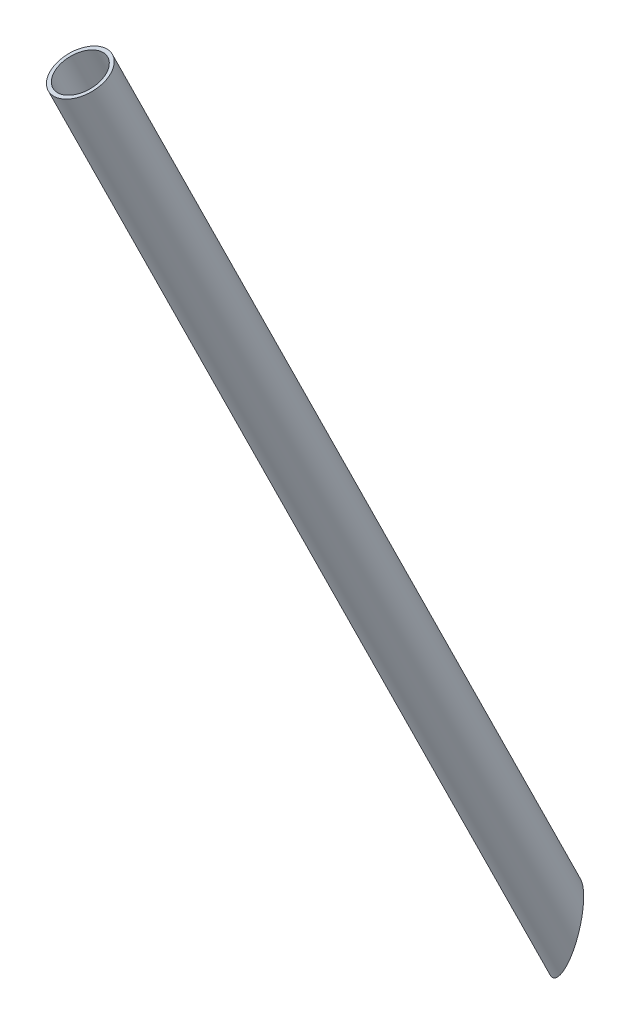
ISO-10303-21;
HEADER;
FILE_DESCRIPTION(('STEP AP214'),'2;1');
FILE_NAME('part.step','',(''),(''),'','','');
FILE_SCHEMA(('AUTOMOTIVE_DESIGN { 1 0 10303 214 1 1 1 1 }'));
ENDSEC;
DATA;
#1=APPLICATION_CONTEXT('core data for automotive mechanical design processes');
#2=APPLICATION_PROTOCOL_DEFINITION('international standard','automotive_design',2000,#1);
#3=PRODUCT_CONTEXT('',#1,'mechanical');
#4=PRODUCT('Part','Part','',(#3));
#5=PRODUCT_RELATED_PRODUCT_CATEGORY('part','',(#4));
#6=PRODUCT_DEFINITION_FORMATION('','',#4);
#7=PRODUCT_DEFINITION_CONTEXT('part definition',#1,'design');
#8=PRODUCT_DEFINITION('design','',#6,#7);
#9=PRODUCT_DEFINITION_SHAPE('','',#8);
#10=(LENGTH_UNIT() NAMED_UNIT(*) SI_UNIT(.MILLI.,.METRE.));
#11=(NAMED_UNIT(*) PLANE_ANGLE_UNIT() SI_UNIT($,.RADIAN.));
#12=(NAMED_UNIT(*) SI_UNIT($,.STERADIAN.) SOLID_ANGLE_UNIT());
#13=UNCERTAINTY_MEASURE_WITH_UNIT(LENGTH_MEASURE(1.E-05),#10,'distance_accuracy_value','');
#14=(GEOMETRIC_REPRESENTATION_CONTEXT(3) GLOBAL_UNCERTAINTY_ASSIGNED_CONTEXT((#13)) GLOBAL_UNIT_ASSIGNED_CONTEXT((#10,
#11,#12)) REPRESENTATION_CONTEXT('',''));
#15=CARTESIAN_POINT('',(0.,0.,0.));
#16=DIRECTION('',(0.,0.,1.));
#17=DIRECTION('',(1.,0.,0.));
#18=AXIS2_PLACEMENT_3D('',#15,#16,#17);
#19=CARTESIAN_POINT('',(-250.,0.,-1700.));
#20=DIRECTION('',(-0.214351342090107,0.914565726251124,0.342962147344171));
#21=DIRECTION('',(0.,-0.351123441588391,0.936329177569045));
#22=AXIS2_PLACEMENT_3D('',#19,#20,#21);
#23=CYLINDRICAL_SURFACE('',#22,9.39999999999998);
#24=CARTESIAN_POINT('',(-325.,320.,-1580.));
#25=DIRECTION('',(0.214351342090107,-0.914565726251124,-0.342962147344171));
#26=DIRECTION('',(0.620647271384696,-0.143596582877078,0.770828765620976));
#27=AXIS2_PLACEMENT_3D('',#24,#25,#26);
#28=CIRCLE('',#27,9.39999999999998);
#29=CARTESIAN_POINT('',(-319.165915648984,318.650192120956,-1572.75420960316));
#30=VERTEX_POINT('',#29);
#31=EDGE_CURVE('E47',#30,#30,#28,.T.);
#32=ORIENTED_EDGE('',*,*,#31,.F.);
#33=EDGE_LOOP('',(#32));
#34=FACE_BOUND('',#33,.T.);
#35=CARTESIAN_POINT('',(-246.393439859568,-15.3879899325122,-1705.77049622469));
#36=DIRECTION('',(0.490298311522791,-0.291983203687868,-0.821190218208954));
#37=DIRECTION('',(0.140336447675245,0.956366902675757,-0.25625773923976));
#38=AXIS2_PLACEMENT_3D('',#35,#36,#37);
#39=ELLIPSE('',#38,14.3781211934559,9.39999999999998);
#40=CARTESIAN_POINT('',(-244.375665407034,-1.63723070043019,-1709.45500105624));
#41=VERTEX_POINT('',#40);
#42=EDGE_CURVE('E43',#41,#41,#39,.T.);
#43=ORIENTED_EDGE('',*,*,#42,.T.);
#44=EDGE_LOOP('',(#43));
#45=FACE_BOUND('',#44,.T.);
#46=ADVANCED_FACE('F39',(#34,#45),#23,.F.);
#47=CARTESIAN_POINT('',(-250.,0.,-1700.));
#48=DIRECTION('',(-0.214351342090107,0.914565726251124,0.342962147344171));
#49=DIRECTION('',(0.,-0.351123441588391,0.936329177569045));
#50=AXIS2_PLACEMENT_3D('',#47,#48,#49);
#51=CYLINDRICAL_SURFACE('',#50,11.);
#52=CARTESIAN_POINT('',(-325.,320.,-1580.));
#53=DIRECTION('',(0.214351342090107,-0.914565726251124,-0.342962147344171));
#54=DIRECTION('',(0.620647271384696,-0.143596582877078,0.770828765620976));
#55=AXIS2_PLACEMENT_3D('',#52,#53,#54);
#56=CIRCLE('',#55,11.);
#57=CARTESIAN_POINT('',(-318.172880014769,318.420437588352,-1571.52088357817));
#58=VERTEX_POINT('',#57);
#59=EDGE_CURVE('E51',#58,#58,#56,.T.);
#60=ORIENTED_EDGE('',*,*,#59,.T.);
#61=EDGE_LOOP('',(#60));
#62=FACE_BOUND('',#61,.T.);
#63=CARTESIAN_POINT('',(-246.393439859568,-15.3879899325122,-1705.77049622469));
#64=DIRECTION('',(0.490298311522791,-0.291983203687868,-0.821190218208954));
#65=DIRECTION('',(0.140336447675245,0.956366902675757,-0.25625773923976));
#66=AXIS2_PLACEMENT_3D('',#63,#64,#65);
#67=ELLIPSE('',#66,16.8254609710654,11.);
#68=CARTESIAN_POINT('',(-244.03221443639,0.703324062477435,-1710.0821508148));
#69=VERTEX_POINT('',#68);
#70=EDGE_CURVE('E10',#69,#69,#67,.T.);
#71=ORIENTED_EDGE('',*,*,#70,.F.);
#72=EDGE_LOOP('',(#71));
#73=FACE_BOUND('',#72,.T.);
#74=ADVANCED_FACE('F67',(#62,#73),#51,.T.);
#75=CARTESIAN_POINT('',(-325.,320.,-1580.));
#76=DIRECTION('',(0.214351342090107,-0.914565726251124,-0.342962147344171));
#77=DIRECTION('',(0.620647271384696,-0.143596582877078,0.770828765620976));
#78=AXIS2_PLACEMENT_3D('',#75,#76,#77);
#79=PLANE('',#78);
#80=ORIENTED_EDGE('',*,*,#31,.T.);
#81=EDGE_LOOP('',(#80));
#82=FACE_BOUND('',#81,.T.);
#83=ORIENTED_EDGE('',*,*,#59,.F.);
#84=EDGE_LOOP('',(#83));
#85=FACE_BOUND('',#84,.T.);
#86=ADVANCED_FACE('F62',(#82,#85),#79,.F.);
#87=CARTESIAN_POINT('',(-235.144715460389,-3.09741723404353,-1703.42440180549));
#88=DIRECTION('',(0.490298311522791,-0.291983203687868,-0.821190218208954));
#89=DIRECTION('',(-0.858605277115103,0.,-0.512637277331737));
#90=AXIS2_PLACEMENT_3D('',#87,#88,#89);
#91=PLANE('',#90);
#92=ORIENTED_EDGE('',*,*,#42,.F.);
#93=EDGE_LOOP('',(#92));
#94=FACE_BOUND('',#93,.T.);
#95=ORIENTED_EDGE('',*,*,#70,.T.);
#96=EDGE_LOOP('',(#95));
#97=FACE_BOUND('',#96,.T.);
#98=ADVANCED_FACE('F41',(#94,#97),#91,.T.);
#99=CLOSED_SHELL('',(#46,#74,#86,#98));
#100=MANIFOLD_SOLID_BREP('B2',#99);
#101=ADVANCED_BREP_SHAPE_REPRESENTATION('',(#18,#100),#14);
#102=SHAPE_DEFINITION_REPRESENTATION(#9,#101);
ENDSEC;
END-ISO-10303-21;
